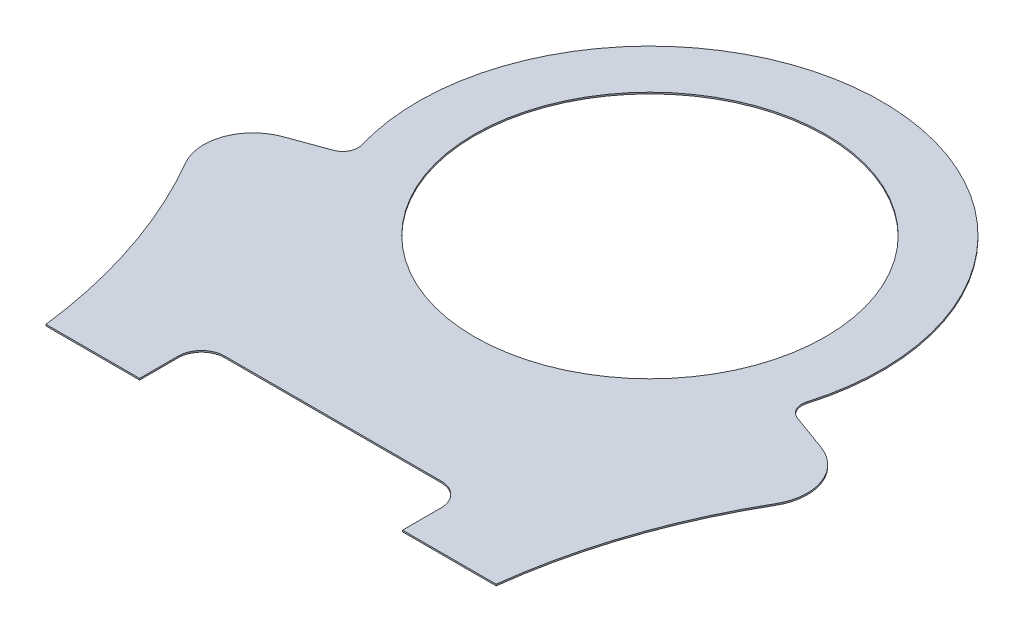
ISO-10303-21;
HEADER;
FILE_DESCRIPTION(('STEP AP214'),'2;1');
FILE_NAME('part.step','',(''),(''),'','','');
FILE_SCHEMA(('AUTOMOTIVE_DESIGN { 1 0 10303 214 1 1 1 1 }'));
ENDSEC;
DATA;
#1=APPLICATION_CONTEXT('core data for automotive mechanical design processes');
#2=APPLICATION_PROTOCOL_DEFINITION('international standard','automotive_design',2000,#1);
#3=PRODUCT_CONTEXT('',#1,'mechanical');
#4=PRODUCT('Part','Part','',(#3));
#5=PRODUCT_RELATED_PRODUCT_CATEGORY('part','',(#4));
#6=PRODUCT_DEFINITION_FORMATION('','',#4);
#7=PRODUCT_DEFINITION_CONTEXT('part definition',#1,'design');
#8=PRODUCT_DEFINITION('design','',#6,#7);
#9=PRODUCT_DEFINITION_SHAPE('','',#8);
#10=(LENGTH_UNIT() NAMED_UNIT(*) SI_UNIT(.MILLI.,.METRE.));
#11=(NAMED_UNIT(*) PLANE_ANGLE_UNIT() SI_UNIT($,.RADIAN.));
#12=(NAMED_UNIT(*) SI_UNIT($,.STERADIAN.) SOLID_ANGLE_UNIT());
#13=UNCERTAINTY_MEASURE_WITH_UNIT(LENGTH_MEASURE(1.E-05),#10,'distance_accuracy_value','');
#14=(GEOMETRIC_REPRESENTATION_CONTEXT(3) GLOBAL_UNCERTAINTY_ASSIGNED_CONTEXT((#13)) GLOBAL_UNIT_ASSIGNED_CONTEXT((#10,
#11,#12)) REPRESENTATION_CONTEXT('',''));
#15=CARTESIAN_POINT('',(0.,0.,0.));
#16=DIRECTION('',(0.,0.,1.));
#17=DIRECTION('',(1.,0.,0.));
#18=AXIS2_PLACEMENT_3D('',#15,#16,#17);
#19=CARTESIAN_POINT('',(-16.3197593877941,0.096,9.34117722210817));
#20=DIRECTION('',(0.,1.,0.));
#21=DIRECTION('',(0.,0.,1.));
#22=AXIS2_PLACEMENT_3D('',#19,#20,#21);
#23=PLANE('',#22);
#24=CARTESIAN_POINT('',(-16.3197593877941,0.096,9.34117722210817));
#25=DIRECTION('',(0.,1.,0.));
#26=DIRECTION('',(0.,0.,1.));
#27=AXIS2_PLACEMENT_3D('',#24,#25,#26);
#28=CIRCLE('',#27,3.19614886021477);
#29=CARTESIAN_POINT('',(-17.4129066790549,0.096,6.33777972323105));
#30=VERTEX_POINT('',#29);
#31=CARTESIAN_POINT('',(-19.0848007187374,0.096,10.9442723455575));
#32=VERTEX_POINT('',#31);
#33=EDGE_CURVE('E209',#30,#32,#28,.T.);
#34=ORIENTED_EDGE('',*,*,#33,.T.);
#35=CARTESIAN_POINT('',(-49.775635094611,0.096,28.7379763209582));
#36=DIRECTION('',(0.,-1.,0.));
#37=DIRECTION('',(0.,0.,1.));
#38=AXIS2_PLACEMENT_3D('',#35,#36,#37);
#39=CIRCLE('',#38,35.4759526419163);
#40=CARTESIAN_POINT('',(-14.5537275290845,0.096,24.5));
#41=VERTEX_POINT('',#40);
#42=EDGE_CURVE('E117',#32,#41,#39,.T.);
#43=ORIENTED_EDGE('',*,*,#42,.T.);
#44=DIRECTION('',(1.,0.,0.));
#45=VECTOR('',#44,1.);
#46=CARTESIAN_POINT('',(-8.50000000000001,0.096,24.5));
#47=LINE('',#46,#45);
#48=CARTESIAN_POINT('',(-8.50000000000001,0.096,24.5));
#49=VERTEX_POINT('',#48);
#50=EDGE_CURVE('E248',#41,#49,#47,.T.);
#51=ORIENTED_EDGE('',*,*,#50,.T.);
#52=DIRECTION('',(0.,0.,-1.));
#53=VECTOR('',#52,1.);
#54=CARTESIAN_POINT('',(-8.50000000000001,0.096,22.));
#55=LINE('',#54,#53);
#56=CARTESIAN_POINT('',(-8.50000000000001,0.096,22.));
#57=VERTEX_POINT('',#56);
#58=EDGE_CURVE('E267',#49,#57,#55,.T.);
#59=ORIENTED_EDGE('',*,*,#58,.T.);
#60=CARTESIAN_POINT('',(-7.00000000000001,0.096,22.));
#61=DIRECTION('',(0.,-1.,0.));
#62=DIRECTION('',(0.,0.,1.));
#63=AXIS2_PLACEMENT_3D('',#60,#61,#62);
#64=CIRCLE('',#63,1.5);
#65=CARTESIAN_POINT('',(-7.,0.096,20.5));
#66=VERTEX_POINT('',#65);
#67=EDGE_CURVE('E264',#57,#66,#64,.T.);
#68=ORIENTED_EDGE('',*,*,#67,.T.);
#69=DIRECTION('',(1.,0.,0.));
#70=VECTOR('',#69,1.);
#71=CARTESIAN_POINT('',(7.,0.096,20.5));
#72=LINE('',#71,#70);
#73=CARTESIAN_POINT('',(7.,0.096,20.5));
#74=VERTEX_POINT('',#73);
#75=EDGE_CURVE('E266',#66,#74,#72,.T.);
#76=ORIENTED_EDGE('',*,*,#75,.T.);
#77=CARTESIAN_POINT('',(7.00000000000001,0.096,22.));
#78=DIRECTION('',(0.,-1.,0.));
#79=DIRECTION('',(0.,0.,1.));
#80=AXIS2_PLACEMENT_3D('',#77,#78,#79);
#81=CIRCLE('',#80,1.5);
#82=CARTESIAN_POINT('',(8.50000000000001,0.096,22.));
#83=VERTEX_POINT('',#82);
#84=EDGE_CURVE('E269',#74,#83,#81,.T.);
#85=ORIENTED_EDGE('',*,*,#84,.T.);
#86=DIRECTION('',(0.,0.,1.));
#87=VECTOR('',#86,1.);
#88=CARTESIAN_POINT('',(8.50000000000001,0.096,24.5));
#89=LINE('',#88,#87);
#90=CARTESIAN_POINT('',(8.50000000000001,0.096,24.5));
#91=VERTEX_POINT('',#90);
#92=EDGE_CURVE('E275',#83,#91,#89,.T.);
#93=ORIENTED_EDGE('',*,*,#92,.T.);
#94=DIRECTION('',(1.,0.,0.));
#95=VECTOR('',#94,1.);
#96=CARTESIAN_POINT('',(14.5537275290844,0.096,24.5));
#97=LINE('',#96,#95);
#98=CARTESIAN_POINT('',(14.5537275290844,0.096,24.5));
#99=VERTEX_POINT('',#98);
#100=EDGE_CURVE('E277',#91,#99,#97,.T.);
#101=ORIENTED_EDGE('',*,*,#100,.T.);
#102=CARTESIAN_POINT('',(49.775635094611,0.096,28.7379763209582));
#103=DIRECTION('',(0.,-1.,0.));
#104=DIRECTION('',(0.,0.,1.));
#105=AXIS2_PLACEMENT_3D('',#102,#103,#104);
#106=CIRCLE('',#105,35.4759526419165);
#107=CARTESIAN_POINT('',(19.0848007187373,0.096,10.9442723455575));
#108=VERTEX_POINT('',#107);
#109=EDGE_CURVE('E279',#99,#108,#106,.T.);
#110=ORIENTED_EDGE('',*,*,#109,.T.);
#111=CARTESIAN_POINT('',(16.3197593877939,0.096,9.34117722210812));
#112=DIRECTION('',(0.,1.,0.));
#113=DIRECTION('',(0.,0.,-1.));
#114=AXIS2_PLACEMENT_3D('',#111,#112,#113);
#115=CIRCLE('',#114,3.19614886021477);
#116=CARTESIAN_POINT('',(17.4129066790547,0.096,6.337779723231));
#117=VERTEX_POINT('',#116);
#118=EDGE_CURVE('E281',#108,#117,#115,.T.);
#119=ORIENTED_EDGE('',*,*,#118,.T.);
#120=DIRECTION('',(-0.93969262078591,0.,-0.342020143325665));
#121=VECTOR('',#120,1.);
#122=CARTESIAN_POINT('',(17.4129066790547,0.096,6.337779723231));
#123=LINE('',#122,#121);
#124=CARTESIAN_POINT('',(15.0056878048849,0.096,5.46162370566939));
#125=VERTEX_POINT('',#124);
#126=EDGE_CURVE('E283',#117,#125,#123,.T.);
#127=ORIENTED_EDGE('',*,*,#126,.T.);
#128=CARTESIAN_POINT('',(15.3477079482105,0.096,4.52193108488347));
#129=DIRECTION('',(0.,-1.,0.));
#130=DIRECTION('',(0.,0.,1.));
#131=AXIS2_PLACEMENT_3D('',#128,#129,#130);
#132=CIRCLE('',#131,1.);
#133=CARTESIAN_POINT('',(14.3884762014474,0.096,4.23931039207827));
#134=VERTEX_POINT('',#133);
#135=EDGE_CURVE('E160',#125,#134,#132,.T.);
#136=ORIENTED_EDGE('',*,*,#135,.T.);
#137=CARTESIAN_POINT('',(0.,0.096,0.));
#138=DIRECTION('',(0.,1.,0.));
#139=DIRECTION('',(0.,0.,1.));
#140=AXIS2_PLACEMENT_3D('',#137,#138,#139);
#141=CIRCLE('',#140,15.);
#142=CARTESIAN_POINT('',(-14.3884762014474,0.096,4.23931039207825));
#143=VERTEX_POINT('',#142);
#144=EDGE_CURVE('E154',#134,#143,#141,.T.);
#145=ORIENTED_EDGE('',*,*,#144,.T.);
#146=CARTESIAN_POINT('',(-15.3477079482105,0.096,4.52193108488347));
#147=DIRECTION('',(0.,-1.,0.));
#148=DIRECTION('',(0.,0.,1.));
#149=AXIS2_PLACEMENT_3D('',#146,#147,#148);
#150=CIRCLE('',#149,1.00000000000001);
#151=CARTESIAN_POINT('',(-15.0056878048849,0.096,5.46162370566938));
#152=VERTEX_POINT('',#151);
#153=EDGE_CURVE('E158',#143,#152,#150,.T.);
#154=ORIENTED_EDGE('',*,*,#153,.T.);
#155=DIRECTION('',(-0.93969262078591,0.,0.342020143325663));
#156=VECTOR('',#155,1.);
#157=CARTESIAN_POINT('',(-15.0056878048849,0.096,5.46162370566938));
#158=LINE('',#157,#156);
#159=EDGE_CURVE('E50',#152,#30,#158,.T.);
#160=ORIENTED_EDGE('',*,*,#159,.T.);
#161=EDGE_LOOP('',(#34,#43,#51,#59,#68,#76,#85,#93,#101,#110,#119,#127,#136,#145,#154,#160));
#162=FACE_BOUND('',#161,.T.);
#163=CARTESIAN_POINT('',(0.,0.096,0.));
#164=DIRECTION('',(0.,1.,0.));
#165=DIRECTION('',(0.,0.,1.));
#166=AXIS2_PLACEMENT_3D('',#163,#164,#165);
#167=CIRCLE('',#166,11.35);
#168=CARTESIAN_POINT('',(0.,0.096,11.35));
#169=VERTEX_POINT('',#168);
#170=EDGE_CURVE('E181',#169,#169,#167,.T.);
#171=ORIENTED_EDGE('',*,*,#170,.F.);
#172=EDGE_LOOP('',(#171));
#173=FACE_BOUND('',#172,.T.);
#174=ADVANCED_FACE('F33',(#162,#173),#23,.T.);
#175=CARTESIAN_POINT('',(-16.3197593877941,0.,9.34117722210817));
#176=DIRECTION('',(0.,1.,0.));
#177=DIRECTION('',(0.,0.,1.));
#178=AXIS2_PLACEMENT_3D('',#175,#176,#177);
#179=PLANE('',#178);
#180=CARTESIAN_POINT('',(-16.3197593877941,0.,9.34117722210817));
#181=DIRECTION('',(0.,1.,0.));
#182=DIRECTION('',(0.,0.,1.));
#183=AXIS2_PLACEMENT_3D('',#180,#181,#182);
#184=CIRCLE('',#183,3.19614886021477);
#185=CARTESIAN_POINT('',(-17.4129066790549,0.,6.33777972323105));
#186=VERTEX_POINT('',#185);
#187=CARTESIAN_POINT('',(-19.0848007187374,0.,10.9442723455575));
#188=VERTEX_POINT('',#187);
#189=EDGE_CURVE('E177',#186,#188,#184,.T.);
#190=ORIENTED_EDGE('',*,*,#189,.F.);
#191=DIRECTION('',(-0.93969262078591,0.,0.342020143325663));
#192=VECTOR('',#191,1.);
#193=CARTESIAN_POINT('',(-15.0056878048849,0.,5.46162370566938));
#194=LINE('',#193,#192);
#195=CARTESIAN_POINT('',(-15.0056878048849,0.,5.46162370566938));
#196=VERTEX_POINT('',#195);
#197=EDGE_CURVE('E109',#196,#186,#194,.T.);
#198=ORIENTED_EDGE('',*,*,#197,.F.);
#199=CARTESIAN_POINT('',(-15.3477079482105,0.,4.52193108488347));
#200=DIRECTION('',(0.,-1.,0.));
#201=DIRECTION('',(0.,0.,1.));
#202=AXIS2_PLACEMENT_3D('',#199,#200,#201);
#203=CIRCLE('',#202,1.00000000000001);
#204=CARTESIAN_POINT('',(-14.3884762014474,0.,4.23931039207825));
#205=VERTEX_POINT('',#204);
#206=EDGE_CURVE('E103',#205,#196,#203,.T.);
#207=ORIENTED_EDGE('',*,*,#206,.F.);
#208=CARTESIAN_POINT('',(0.,0.,0.));
#209=DIRECTION('',(0.,1.,0.));
#210=DIRECTION('',(0.,0.,1.));
#211=AXIS2_PLACEMENT_3D('',#208,#209,#210);
#212=CIRCLE('',#211,15.);
#213=CARTESIAN_POINT('',(14.3884762014474,0.,4.23931039207827));
#214=VERTEX_POINT('',#213);
#215=EDGE_CURVE('E167',#214,#205,#212,.T.);
#216=ORIENTED_EDGE('',*,*,#215,.F.);
#217=CARTESIAN_POINT('',(15.3477079482105,0.,4.52193108488347));
#218=DIRECTION('',(0.,-1.,0.));
#219=DIRECTION('',(0.,0.,1.));
#220=AXIS2_PLACEMENT_3D('',#217,#218,#219);
#221=CIRCLE('',#220,1.);
#222=CARTESIAN_POINT('',(15.0056878048849,0.,5.46162370566939));
#223=VERTEX_POINT('',#222);
#224=EDGE_CURVE('E203',#223,#214,#221,.T.);
#225=ORIENTED_EDGE('',*,*,#224,.F.);
#226=DIRECTION('',(-0.93969262078591,0.,-0.342020143325665));
#227=VECTOR('',#226,1.);
#228=CARTESIAN_POINT('',(17.4129066790547,0.,6.337779723231));
#229=LINE('',#228,#227);
#230=CARTESIAN_POINT('',(17.4129066790547,0.,6.337779723231));
#231=VERTEX_POINT('',#230);
#232=EDGE_CURVE('E201',#231,#223,#229,.T.);
#233=ORIENTED_EDGE('',*,*,#232,.F.);
#234=CARTESIAN_POINT('',(16.3197593877939,0.,9.34117722210812));
#235=DIRECTION('',(0.,1.,0.));
#236=DIRECTION('',(0.,0.,-1.));
#237=AXIS2_PLACEMENT_3D('',#234,#235,#236);
#238=CIRCLE('',#237,3.19614886021477);
#239=CARTESIAN_POINT('',(19.0848007187373,0.,10.9442723455575));
#240=VERTEX_POINT('',#239);
#241=EDGE_CURVE('E199',#240,#231,#238,.T.);
#242=ORIENTED_EDGE('',*,*,#241,.F.);
#243=CARTESIAN_POINT('',(49.775635094611,0.,28.7379763209582));
#244=DIRECTION('',(0.,-1.,0.));
#245=DIRECTION('',(0.,0.,1.));
#246=AXIS2_PLACEMENT_3D('',#243,#244,#245);
#247=CIRCLE('',#246,35.4759526419165);
#248=CARTESIAN_POINT('',(14.5537275290844,0.,24.5));
#249=VERTEX_POINT('',#248);
#250=EDGE_CURVE('E197',#249,#240,#247,.T.);
#251=ORIENTED_EDGE('',*,*,#250,.F.);
#252=DIRECTION('',(1.,0.,0.));
#253=VECTOR('',#252,1.);
#254=CARTESIAN_POINT('',(14.5537275290844,0.,24.5));
#255=LINE('',#254,#253);
#256=CARTESIAN_POINT('',(8.50000000000001,0.,24.5));
#257=VERTEX_POINT('',#256);
#258=EDGE_CURVE('E195',#257,#249,#255,.T.);
#259=ORIENTED_EDGE('',*,*,#258,.F.);
#260=DIRECTION('',(0.,0.,1.));
#261=VECTOR('',#260,1.);
#262=CARTESIAN_POINT('',(8.50000000000001,0.,24.5));
#263=LINE('',#262,#261);
#264=CARTESIAN_POINT('',(8.50000000000001,0.,22.));
#265=VERTEX_POINT('',#264);
#266=EDGE_CURVE('E193',#265,#257,#263,.T.);
#267=ORIENTED_EDGE('',*,*,#266,.F.);
#268=CARTESIAN_POINT('',(7.00000000000001,0.,22.));
#269=DIRECTION('',(0.,-1.,0.));
#270=DIRECTION('',(0.,0.,1.));
#271=AXIS2_PLACEMENT_3D('',#268,#269,#270);
#272=CIRCLE('',#271,1.5);
#273=CARTESIAN_POINT('',(7.,0.,20.5));
#274=VERTEX_POINT('',#273);
#275=EDGE_CURVE('E191',#274,#265,#272,.T.);
#276=ORIENTED_EDGE('',*,*,#275,.F.);
#277=DIRECTION('',(1.,0.,0.));
#278=VECTOR('',#277,1.);
#279=CARTESIAN_POINT('',(7.,0.,20.5));
#280=LINE('',#279,#278);
#281=CARTESIAN_POINT('',(-7.,0.,20.5));
#282=VERTEX_POINT('',#281);
#283=EDGE_CURVE('E189',#282,#274,#280,.T.);
#284=ORIENTED_EDGE('',*,*,#283,.F.);
#285=CARTESIAN_POINT('',(-7.00000000000001,0.,22.));
#286=DIRECTION('',(0.,-1.,0.));
#287=DIRECTION('',(0.,0.,1.));
#288=AXIS2_PLACEMENT_3D('',#285,#286,#287);
#289=CIRCLE('',#288,1.5);
#290=CARTESIAN_POINT('',(-8.50000000000001,0.,22.));
#291=VERTEX_POINT('',#290);
#292=EDGE_CURVE('E187',#291,#282,#289,.T.);
#293=ORIENTED_EDGE('',*,*,#292,.F.);
#294=DIRECTION('',(0.,0.,-1.));
#295=VECTOR('',#294,1.);
#296=CARTESIAN_POINT('',(-8.50000000000001,0.,22.));
#297=LINE('',#296,#295);
#298=CARTESIAN_POINT('',(-8.50000000000001,0.,24.5));
#299=VERTEX_POINT('',#298);
#300=EDGE_CURVE('E185',#299,#291,#297,.T.);
#301=ORIENTED_EDGE('',*,*,#300,.F.);
#302=DIRECTION('',(1.,0.,0.));
#303=VECTOR('',#302,1.);
#304=CARTESIAN_POINT('',(-8.50000000000001,0.,24.5));
#305=LINE('',#304,#303);
#306=CARTESIAN_POINT('',(-14.5537275290845,0.,24.5));
#307=VERTEX_POINT('',#306);
#308=EDGE_CURVE('E183',#307,#299,#305,.T.);
#309=ORIENTED_EDGE('',*,*,#308,.F.);
#310=CARTESIAN_POINT('',(-49.775635094611,0.,28.7379763209582));
#311=DIRECTION('',(0.,-1.,0.));
#312=DIRECTION('',(0.,0.,1.));
#313=AXIS2_PLACEMENT_3D('',#310,#311,#312);
#314=CIRCLE('',#313,35.4759526419163);
#315=EDGE_CURVE('E180',#188,#307,#314,.T.);
#316=ORIENTED_EDGE('',*,*,#315,.F.);
#317=EDGE_LOOP('',(#190,#198,#207,#216,#225,#233,#242,#251,#259,#267,#276,#284,#293,#301,#309,#316));
#318=FACE_BOUND('',#317,.T.);
#319=CARTESIAN_POINT('',(0.,0.,0.));
#320=DIRECTION('',(0.,1.,0.));
#321=DIRECTION('',(0.,0.,1.));
#322=AXIS2_PLACEMENT_3D('',#319,#320,#321);
#323=CIRCLE('',#322,11.35);
#324=CARTESIAN_POINT('',(0.,0.,11.35));
#325=VERTEX_POINT('',#324);
#326=EDGE_CURVE('E485',#325,#325,#323,.T.);
#327=ORIENTED_EDGE('',*,*,#326,.T.);
#328=EDGE_LOOP('',(#327));
#329=FACE_BOUND('',#328,.T.);
#330=ADVANCED_FACE('F252',(#318,#329),#179,.F.);
#331=CARTESIAN_POINT('',(-16.3197593877941,0.096,9.34117722210817));
#332=DIRECTION('',(0.,-1.,0.));
#333=DIRECTION('',(0.,0.,-1.));
#334=AXIS2_PLACEMENT_3D('',#331,#332,#333);
#335=CYLINDRICAL_SURFACE('',#334,3.19614886021477);
#336=ORIENTED_EDGE('',*,*,#189,.T.);
#337=DIRECTION('',(0.,-1.,0.));
#338=VECTOR('',#337,1.);
#339=CARTESIAN_POINT('',(-19.0848007187374,0.096,10.9442723455575));
#340=LINE('',#339,#338);
#341=EDGE_CURVE('E11',#32,#188,#340,.T.);
#342=ORIENTED_EDGE('',*,*,#341,.F.);
#343=ORIENTED_EDGE('',*,*,#33,.F.);
#344=DIRECTION('',(0.,-1.,0.));
#345=VECTOR('',#344,1.);
#346=CARTESIAN_POINT('',(-17.4129066790549,0.096,6.33777972323105));
#347=LINE('',#346,#345);
#348=EDGE_CURVE('E173',#30,#186,#347,.T.);
#349=ORIENTED_EDGE('',*,*,#348,.T.);
#350=EDGE_LOOP('',(#336,#342,#343,#349));
#351=FACE_BOUND('',#350,.T.);
#352=ADVANCED_FACE('F35',(#351),#335,.T.);
#353=CARTESIAN_POINT('',(-49.775635094611,0.096,28.7379763209582));
#354=DIRECTION('',(0.,-1.,0.));
#355=DIRECTION('',(0.,0.,-1.));
#356=AXIS2_PLACEMENT_3D('',#353,#354,#355);
#357=CYLINDRICAL_SURFACE('',#356,35.4759526419163);
#358=ORIENTED_EDGE('',*,*,#315,.T.);
#359=DIRECTION('',(0.,-1.,0.));
#360=VECTOR('',#359,1.);
#361=CARTESIAN_POINT('',(-14.5537275290845,0.096,24.5));
#362=LINE('',#361,#360);
#363=EDGE_CURVE('E42',#41,#307,#362,.T.);
#364=ORIENTED_EDGE('',*,*,#363,.F.);
#365=ORIENTED_EDGE('',*,*,#42,.F.);
#366=ORIENTED_EDGE('',*,*,#341,.T.);
#367=EDGE_LOOP('',(#358,#364,#365,#366));
#368=FACE_BOUND('',#367,.T.);
#369=ADVANCED_FACE('F318',(#368),#357,.F.);
#370=CARTESIAN_POINT('',(-8.50000000000001,0.096,24.5));
#371=DIRECTION('',(0.,0.,-1.));
#372=DIRECTION('',(-1.,0.,0.));
#373=AXIS2_PLACEMENT_3D('',#370,#371,#372);
#374=PLANE('',#373);
#375=ORIENTED_EDGE('',*,*,#308,.T.);
#376=DIRECTION('',(0.,-1.,0.));
#377=VECTOR('',#376,1.);
#378=CARTESIAN_POINT('',(-8.50000000000001,0.096,24.5));
#379=LINE('',#378,#377);
#380=EDGE_CURVE('E240',#49,#299,#379,.T.);
#381=ORIENTED_EDGE('',*,*,#380,.F.);
#382=ORIENTED_EDGE('',*,*,#50,.F.);
#383=ORIENTED_EDGE('',*,*,#363,.T.);
#384=EDGE_LOOP('',(#375,#381,#382,#383));
#385=FACE_BOUND('',#384,.T.);
#386=ADVANCED_FACE('F246',(#385),#374,.F.);
#387=CARTESIAN_POINT('',(-8.50000000000001,0.096,22.));
#388=DIRECTION('',(-1.,0.,0.));
#389=DIRECTION('',(0.,0.,1.));
#390=AXIS2_PLACEMENT_3D('',#387,#388,#389);
#391=PLANE('',#390);
#392=ORIENTED_EDGE('',*,*,#300,.T.);
#393=DIRECTION('',(0.,-1.,0.));
#394=VECTOR('',#393,1.);
#395=CARTESIAN_POINT('',(-8.50000000000001,0.096,22.));
#396=LINE('',#395,#394);
#397=EDGE_CURVE('E237',#57,#291,#396,.T.);
#398=ORIENTED_EDGE('',*,*,#397,.F.);
#399=ORIENTED_EDGE('',*,*,#58,.F.);
#400=ORIENTED_EDGE('',*,*,#380,.T.);
#401=EDGE_LOOP('',(#392,#398,#399,#400));
#402=FACE_BOUND('',#401,.T.);
#403=ADVANCED_FACE('F258',(#402),#391,.F.);
#404=CARTESIAN_POINT('',(-7.00000000000001,0.096,22.));
#405=DIRECTION('',(0.,-1.,0.));
#406=DIRECTION('',(0.,0.,-1.));
#407=AXIS2_PLACEMENT_3D('',#404,#405,#406);
#408=CYLINDRICAL_SURFACE('',#407,1.5);
#409=ORIENTED_EDGE('',*,*,#292,.T.);
#410=DIRECTION('',(0.,-1.,0.));
#411=VECTOR('',#410,1.);
#412=CARTESIAN_POINT('',(-7.,0.096,20.5));
#413=LINE('',#412,#411);
#414=EDGE_CURVE('E234',#66,#282,#413,.T.);
#415=ORIENTED_EDGE('',*,*,#414,.F.);
#416=ORIENTED_EDGE('',*,*,#67,.F.);
#417=ORIENTED_EDGE('',*,*,#397,.T.);
#418=EDGE_LOOP('',(#409,#415,#416,#417));
#419=FACE_BOUND('',#418,.T.);
#420=ADVANCED_FACE('F262',(#419),#408,.F.);
#421=CARTESIAN_POINT('',(7.,0.096,20.5));
#422=DIRECTION('',(0.,0.,-1.));
#423=DIRECTION('',(-1.,0.,0.));
#424=AXIS2_PLACEMENT_3D('',#421,#422,#423);
#425=PLANE('',#424);
#426=ORIENTED_EDGE('',*,*,#283,.T.);
#427=DIRECTION('',(0.,-1.,0.));
#428=VECTOR('',#427,1.);
#429=CARTESIAN_POINT('',(7.,0.096,20.5));
#430=LINE('',#429,#428);
#431=EDGE_CURVE('E231',#74,#274,#430,.T.);
#432=ORIENTED_EDGE('',*,*,#431,.F.);
#433=ORIENTED_EDGE('',*,*,#75,.F.);
#434=ORIENTED_EDGE('',*,*,#414,.T.);
#435=EDGE_LOOP('',(#426,#432,#433,#434));
#436=FACE_BOUND('',#435,.T.);
#437=ADVANCED_FACE('F331',(#436),#425,.F.);
#438=CARTESIAN_POINT('',(7.00000000000001,0.096,22.));
#439=DIRECTION('',(0.,-1.,0.));
#440=DIRECTION('',(0.,0.,-1.));
#441=AXIS2_PLACEMENT_3D('',#438,#439,#440);
#442=CYLINDRICAL_SURFACE('',#441,1.5);
#443=ORIENTED_EDGE('',*,*,#275,.T.);
#444=DIRECTION('',(0.,-1.,0.));
#445=VECTOR('',#444,1.);
#446=CARTESIAN_POINT('',(8.50000000000001,0.096,22.));
#447=LINE('',#446,#445);
#448=EDGE_CURVE('E228',#83,#265,#447,.T.);
#449=ORIENTED_EDGE('',*,*,#448,.F.);
#450=ORIENTED_EDGE('',*,*,#84,.F.);
#451=ORIENTED_EDGE('',*,*,#431,.T.);
#452=EDGE_LOOP('',(#443,#449,#450,#451));
#453=FACE_BOUND('',#452,.T.);
#454=ADVANCED_FACE('F334',(#453),#442,.F.);
#455=CARTESIAN_POINT('',(8.50000000000001,0.096,24.5));
#456=DIRECTION('',(1.,0.,0.));
#457=DIRECTION('',(0.,0.,-1.));
#458=AXIS2_PLACEMENT_3D('',#455,#456,#457);
#459=PLANE('',#458);
#460=ORIENTED_EDGE('',*,*,#266,.T.);
#461=DIRECTION('',(0.,-1.,0.));
#462=VECTOR('',#461,1.);
#463=CARTESIAN_POINT('',(8.50000000000001,0.096,24.5));
#464=LINE('',#463,#462);
#465=EDGE_CURVE('E225',#91,#257,#464,.T.);
#466=ORIENTED_EDGE('',*,*,#465,.F.);
#467=ORIENTED_EDGE('',*,*,#92,.F.);
#468=ORIENTED_EDGE('',*,*,#448,.T.);
#469=EDGE_LOOP('',(#460,#466,#467,#468));
#470=FACE_BOUND('',#469,.T.);
#471=ADVANCED_FACE('F338',(#470),#459,.F.);
#472=CARTESIAN_POINT('',(14.5537275290844,0.096,24.5));
#473=DIRECTION('',(0.,0.,-1.));
#474=DIRECTION('',(-1.,0.,0.));
#475=AXIS2_PLACEMENT_3D('',#472,#473,#474);
#476=PLANE('',#475);
#477=ORIENTED_EDGE('',*,*,#258,.T.);
#478=DIRECTION('',(0.,-1.,0.));
#479=VECTOR('',#478,1.);
#480=CARTESIAN_POINT('',(14.5537275290844,0.096,24.5));
#481=LINE('',#480,#479);
#482=EDGE_CURVE('E222',#99,#249,#481,.T.);
#483=ORIENTED_EDGE('',*,*,#482,.F.);
#484=ORIENTED_EDGE('',*,*,#100,.F.);
#485=ORIENTED_EDGE('',*,*,#465,.T.);
#486=EDGE_LOOP('',(#477,#483,#484,#485));
#487=FACE_BOUND('',#486,.T.);
#488=ADVANCED_FACE('F342',(#487),#476,.F.);
#489=CARTESIAN_POINT('',(49.775635094611,0.096,28.7379763209582));
#490=DIRECTION('',(0.,-1.,0.));
#491=DIRECTION('',(0.,0.,-1.));
#492=AXIS2_PLACEMENT_3D('',#489,#490,#491);
#493=CYLINDRICAL_SURFACE('',#492,35.4759526419165);
#494=ORIENTED_EDGE('',*,*,#250,.T.);
#495=DIRECTION('',(0.,-1.,0.));
#496=VECTOR('',#495,1.);
#497=CARTESIAN_POINT('',(19.0848007187373,0.096,10.9442723455575));
#498=LINE('',#497,#496);
#499=EDGE_CURVE('E219',#108,#240,#498,.T.);
#500=ORIENTED_EDGE('',*,*,#499,.F.);
#501=ORIENTED_EDGE('',*,*,#109,.F.);
#502=ORIENTED_EDGE('',*,*,#482,.T.);
#503=EDGE_LOOP('',(#494,#500,#501,#502));
#504=FACE_BOUND('',#503,.T.);
#505=ADVANCED_FACE('F346',(#504),#493,.F.);
#506=CARTESIAN_POINT('',(16.3197593877939,0.096,9.34117722210812));
#507=DIRECTION('',(0.,-1.,0.));
#508=DIRECTION('',(0.,0.,-1.));
#509=AXIS2_PLACEMENT_3D('',#506,#507,#508);
#510=CYLINDRICAL_SURFACE('',#509,3.19614886021477);
#511=ORIENTED_EDGE('',*,*,#241,.T.);
#512=DIRECTION('',(0.,-1.,0.));
#513=VECTOR('',#512,1.);
#514=CARTESIAN_POINT('',(17.4129066790547,0.096,6.337779723231));
#515=LINE('',#514,#513);
#516=EDGE_CURVE('E216',#117,#231,#515,.T.);
#517=ORIENTED_EDGE('',*,*,#516,.F.);
#518=ORIENTED_EDGE('',*,*,#118,.F.);
#519=ORIENTED_EDGE('',*,*,#499,.T.);
#520=EDGE_LOOP('',(#511,#517,#518,#519));
#521=FACE_BOUND('',#520,.T.);
#522=ADVANCED_FACE('F350',(#521),#510,.T.);
#523=CARTESIAN_POINT('',(17.4129066790547,0.096,6.337779723231));
#524=DIRECTION('',(-0.342020143325665,0.,0.93969262078591));
#525=DIRECTION('',(0.93969262078591,0.,0.342020143325665));
#526=AXIS2_PLACEMENT_3D('',#523,#524,#525);
#527=PLANE('',#526);
#528=ORIENTED_EDGE('',*,*,#232,.T.);
#529=DIRECTION('',(0.,-1.,0.));
#530=VECTOR('',#529,1.);
#531=CARTESIAN_POINT('',(15.0056878048849,0.096,5.46162370566939));
#532=LINE('',#531,#530);
#533=EDGE_CURVE('E213',#125,#223,#532,.T.);
#534=ORIENTED_EDGE('',*,*,#533,.F.);
#535=ORIENTED_EDGE('',*,*,#126,.F.);
#536=ORIENTED_EDGE('',*,*,#516,.T.);
#537=EDGE_LOOP('',(#528,#534,#535,#536));
#538=FACE_BOUND('',#537,.T.);
#539=ADVANCED_FACE('F289',(#538),#527,.F.);
#540=CARTESIAN_POINT('',(15.3477079482105,0.096,4.52193108488347));
#541=DIRECTION('',(0.,-1.,0.));
#542=DIRECTION('',(0.,0.,-1.));
#543=AXIS2_PLACEMENT_3D('',#540,#541,#542);
#544=CYLINDRICAL_SURFACE('',#543,1.);
#545=ORIENTED_EDGE('',*,*,#224,.T.);
#546=DIRECTION('',(0.,-1.,0.));
#547=VECTOR('',#546,1.);
#548=CARTESIAN_POINT('',(14.3884762014474,0.096,4.23931039207827));
#549=LINE('',#548,#547);
#550=EDGE_CURVE('E168',#134,#214,#549,.T.);
#551=ORIENTED_EDGE('',*,*,#550,.F.);
#552=ORIENTED_EDGE('',*,*,#135,.F.);
#553=ORIENTED_EDGE('',*,*,#533,.T.);
#554=EDGE_LOOP('',(#545,#551,#552,#553));
#555=FACE_BOUND('',#554,.T.);
#556=ADVANCED_FACE('F293',(#555),#544,.F.);
#557=CARTESIAN_POINT('',(0.,0.096,0.));
#558=DIRECTION('',(0.,-1.,0.));
#559=DIRECTION('',(0.,0.,-1.));
#560=AXIS2_PLACEMENT_3D('',#557,#558,#559);
#561=CYLINDRICAL_SURFACE('',#560,15.);
#562=ORIENTED_EDGE('',*,*,#215,.T.);
#563=DIRECTION('',(0.,-1.,0.));
#564=VECTOR('',#563,1.);
#565=CARTESIAN_POINT('',(-14.3884762014474,0.096,4.23931039207825));
#566=LINE('',#565,#564);
#567=EDGE_CURVE('E165',#143,#205,#566,.T.);
#568=ORIENTED_EDGE('',*,*,#567,.F.);
#569=ORIENTED_EDGE('',*,*,#144,.F.);
#570=ORIENTED_EDGE('',*,*,#550,.T.);
#571=EDGE_LOOP('',(#562,#568,#569,#570));
#572=FACE_BOUND('',#571,.T.);
#573=ADVANCED_FACE('F166',(#572),#561,.T.);
#574=CARTESIAN_POINT('',(-15.3477079482105,0.096,4.52193108488347));
#575=DIRECTION('',(0.,-1.,0.));
#576=DIRECTION('',(0.,0.,-1.));
#577=AXIS2_PLACEMENT_3D('',#574,#575,#576);
#578=CYLINDRICAL_SURFACE('',#577,1.00000000000001);
#579=ORIENTED_EDGE('',*,*,#206,.T.);
#580=DIRECTION('',(0.,-1.,0.));
#581=VECTOR('',#580,1.);
#582=CARTESIAN_POINT('',(-15.0056878048849,0.096,5.46162370566938));
#583=LINE('',#582,#581);
#584=EDGE_CURVE('E169',#152,#196,#583,.T.);
#585=ORIENTED_EDGE('',*,*,#584,.F.);
#586=ORIENTED_EDGE('',*,*,#153,.F.);
#587=ORIENTED_EDGE('',*,*,#567,.T.);
#588=EDGE_LOOP('',(#579,#585,#586,#587));
#589=FACE_BOUND('',#588,.T.);
#590=ADVANCED_FACE('F171',(#589),#578,.F.);
#591=CARTESIAN_POINT('',(-15.0056878048849,0.096,5.46162370566938));
#592=DIRECTION('',(0.342020143325663,0.,0.939692620785911));
#593=DIRECTION('',(0.939692620785911,0.,-0.342020143325663));
#594=AXIS2_PLACEMENT_3D('',#591,#592,#593);
#595=PLANE('',#594);
#596=ORIENTED_EDGE('',*,*,#197,.T.);
#597=ORIENTED_EDGE('',*,*,#348,.F.);
#598=ORIENTED_EDGE('',*,*,#159,.F.);
#599=ORIENTED_EDGE('',*,*,#584,.T.);
#600=EDGE_LOOP('',(#596,#597,#598,#599));
#601=FACE_BOUND('',#600,.T.);
#602=ADVANCED_FACE('F298',(#601),#595,.F.);
#603=CARTESIAN_POINT('',(0.,0.096,0.));
#604=DIRECTION('',(0.,-1.,0.));
#605=DIRECTION('',(0.,0.,-1.));
#606=AXIS2_PLACEMENT_3D('',#603,#604,#605);
#607=CYLINDRICAL_SURFACE('',#606,11.35);
#608=ORIENTED_EDGE('',*,*,#170,.T.);
#609=EDGE_LOOP('',(#608));
#610=FACE_BOUND('',#609,.T.);
#611=ORIENTED_EDGE('',*,*,#326,.F.);
#612=EDGE_LOOP('',(#611));
#613=FACE_BOUND('',#612,.T.);
#614=ADVANCED_FACE('F300',(#610,#613),#607,.F.);
#615=CLOSED_SHELL('',(#174,#330,#352,#369,#386,#403,#420,#437,#454,#471,#488,#505,#522,#539,
#556,#573,#590,#602,#614));
#616=MANIFOLD_SOLID_BREP('B2',#615);
#617=ADVANCED_BREP_SHAPE_REPRESENTATION('',(#18,#616),#14);
#618=SHAPE_DEFINITION_REPRESENTATION(#9,#617);
ENDSEC;
END-ISO-10303-21;
